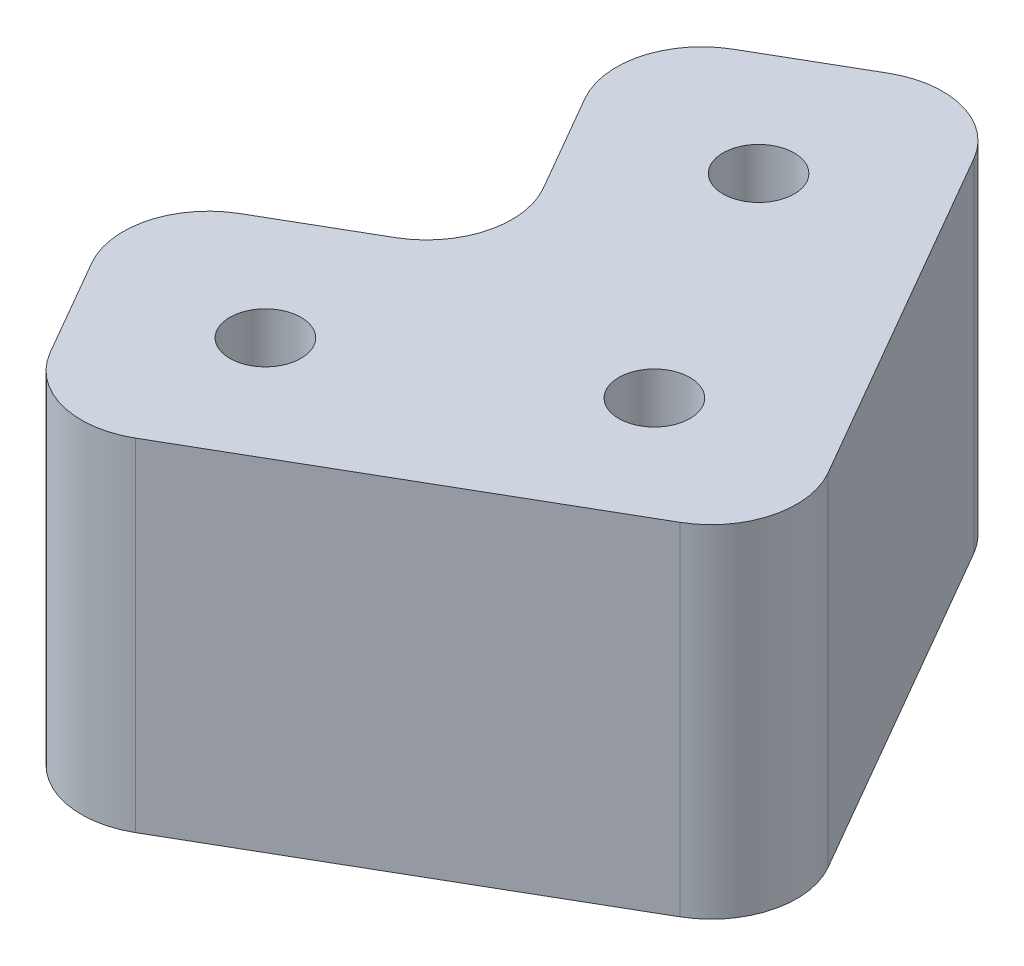
ISO-10303-21;
HEADER;
FILE_DESCRIPTION(('STEP AP214'),'2;1');
FILE_NAME('part.step','',(''),(''),'','','');
FILE_SCHEMA(('AUTOMOTIVE_DESIGN { 1 0 10303 214 1 1 1 1 }'));
ENDSEC;
DATA;
#1=APPLICATION_CONTEXT('core data for automotive mechanical design processes');
#2=APPLICATION_PROTOCOL_DEFINITION('international standard','automotive_design',2000,#1);
#3=PRODUCT_CONTEXT('',#1,'mechanical');
#4=PRODUCT('Part','Part','',(#3));
#5=PRODUCT_RELATED_PRODUCT_CATEGORY('part','',(#4));
#6=PRODUCT_DEFINITION_FORMATION('','',#4);
#7=PRODUCT_DEFINITION_CONTEXT('part definition',#1,'design');
#8=PRODUCT_DEFINITION('design','',#6,#7);
#9=PRODUCT_DEFINITION_SHAPE('','',#8);
#10=(LENGTH_UNIT() NAMED_UNIT(*) SI_UNIT(.MILLI.,.METRE.));
#11=(NAMED_UNIT(*) PLANE_ANGLE_UNIT() SI_UNIT($,.RADIAN.));
#12=(NAMED_UNIT(*) SI_UNIT($,.STERADIAN.) SOLID_ANGLE_UNIT());
#13=UNCERTAINTY_MEASURE_WITH_UNIT(LENGTH_MEASURE(1.E-05),#10,'distance_accuracy_value','');
#14=(GEOMETRIC_REPRESENTATION_CONTEXT(3) GLOBAL_UNCERTAINTY_ASSIGNED_CONTEXT((#13)) GLOBAL_UNIT_ASSIGNED_CONTEXT((#10,
#11,#12)) REPRESENTATION_CONTEXT('',''));
#15=CARTESIAN_POINT('',(0.,0.,0.));
#16=DIRECTION('',(0.,0.,1.));
#17=DIRECTION('',(1.,0.,0.));
#18=AXIS2_PLACEMENT_3D('',#15,#16,#17);
#19=CARTESIAN_POINT('',(0.,12.,0.));
#20=DIRECTION('',(0.,-1.,0.));
#21=DIRECTION('',(0.,0.,-1.));
#22=AXIS2_PLACEMENT_3D('',#19,#20,#21);
#23=PLANE('',#22);
#24=DIRECTION('',(-0.866025403784439,0.,0.499999999999999));
#25=VECTOR('',#24,1.);
#26=CARTESIAN_POINT('',(-68.7916512459885,12.,10.8493649053889));
#27=LINE('',#26,#25);
#28=CARTESIAN_POINT('',(-62.7294734194975,12.,7.3493649053889));
#29=VERTEX_POINT('',#28);
#30=CARTESIAN_POINT('',(-66.1935750346352,12.,9.3493649053889));
#31=VERTEX_POINT('',#30);
#32=EDGE_CURVE('E185',#29,#31,#27,.T.);
#33=ORIENTED_EDGE('',*,*,#32,.T.);
#34=CARTESIAN_POINT('',(-64.6935750346352,12.,11.9474411167422));
#35=DIRECTION('',(0.,-1.,0.));
#36=DIRECTION('',(0.,0.,-1.));
#37=AXIS2_PLACEMENT_3D('',#34,#35,#36);
#38=CIRCLE('',#37,3.);
#39=CARTESIAN_POINT('',(-67.2916512459885,12.,13.4474411167422));
#40=VERTEX_POINT('',#39);
#41=EDGE_CURVE('E228',#31,#40,#38,.F.);
#42=ORIENTED_EDGE('',*,*,#41,.T.);
#43=DIRECTION('',(0.499999999999999,0.,0.866025403784439));
#44=VECTOR('',#43,1.);
#45=CARTESIAN_POINT('',(-63.7916512459886,12.,19.5096189432333));
#46=LINE('',#45,#44);
#47=CARTESIAN_POINT('',(-65.2916512459886,12.,16.91154273188));
#48=VERTEX_POINT('',#47);
#49=EDGE_CURVE('E157',#40,#48,#46,.T.);
#50=ORIENTED_EDGE('',*,*,#49,.T.);
#51=CARTESIAN_POINT('',(-67.8897274573419,12.,18.41154273188));
#52=DIRECTION('',(0.,-1.,0.));
#53=DIRECTION('',(0.,0.,-1.));
#54=AXIS2_PLACEMENT_3D('',#51,#52,#53);
#55=CIRCLE('',#54,3.);
#56=CARTESIAN_POINT('',(-66.3897274573419,12.,21.0096189432333));
#57=VERTEX_POINT('',#56);
#58=EDGE_CURVE('E11',#48,#57,#55,.T.);
#59=ORIENTED_EDGE('',*,*,#58,.T.);
#60=DIRECTION('',(-0.86602540378444,0.,0.499999999999998));
#61=VECTOR('',#60,1.);
#62=CARTESIAN_POINT('',(-72.451905283833,12.,24.5096189432333));
#63=LINE('',#62,#61);
#64=CARTESIAN_POINT('',(-69.8538290724796,12.,23.0096189432333));
#65=VERTEX_POINT('',#64);
#66=EDGE_CURVE('E262',#57,#65,#63,.T.);
#67=ORIENTED_EDGE('',*,*,#66,.T.);
#68=CARTESIAN_POINT('',(-68.3538290724796,12.,25.6076951545866));
#69=DIRECTION('',(0.,-1.,0.));
#70=DIRECTION('',(0.,0.,-1.));
#71=AXIS2_PLACEMENT_3D('',#68,#69,#70);
#72=CIRCLE('',#71,3.);
#73=CARTESIAN_POINT('',(-70.951905283833,12.,27.1076951545866));
#74=VERTEX_POINT('',#73);
#75=EDGE_CURVE('E213',#65,#74,#72,.F.);
#76=ORIENTED_EDGE('',*,*,#75,.T.);
#77=DIRECTION('',(0.499999999999999,0.,0.866025403784439));
#78=VECTOR('',#77,1.);
#79=CARTESIAN_POINT('',(-67.451905283833,12.,33.1698729810777));
#80=LINE('',#79,#78);
#81=CARTESIAN_POINT('',(-68.951905283833,12.,30.5717967697244));
#82=VERTEX_POINT('',#81);
#83=EDGE_CURVE('E259',#74,#82,#80,.T.);
#84=ORIENTED_EDGE('',*,*,#83,.T.);
#85=CARTESIAN_POINT('',(-66.3538290724796,12.,29.0717967697244));
#86=DIRECTION('',(0.,-1.,0.));
#87=DIRECTION('',(0.,0.,-1.));
#88=AXIS2_PLACEMENT_3D('',#85,#86,#87);
#89=CIRCLE('',#88,3.);
#90=CARTESIAN_POINT('',(-64.8538290724797,12.,31.6698729810777));
#91=VERTEX_POINT('',#90);
#92=EDGE_CURVE('E219',#82,#91,#89,.F.);
#93=ORIENTED_EDGE('',*,*,#92,.T.);
#94=DIRECTION('',(0.86602540378444,0.,-0.499999999999998));
#95=VECTOR('',#94,1.);
#96=CARTESIAN_POINT('',(-50.1313972081442,12.,23.1698729810777));
#97=LINE('',#96,#95);
#98=CARTESIAN_POINT('',(-52.7294734194975,12.,24.6698729810777));
#99=VERTEX_POINT('',#98);
#100=EDGE_CURVE('E257',#91,#99,#97,.T.);
#101=ORIENTED_EDGE('',*,*,#100,.T.);
#102=CARTESIAN_POINT('',(-54.2294734194975,12.,22.0717967697244));
#103=DIRECTION('',(0.,-1.,0.));
#104=DIRECTION('',(0.,0.,-1.));
#105=AXIS2_PLACEMENT_3D('',#102,#103,#104);
#106=CIRCLE('',#105,3.);
#107=CARTESIAN_POINT('',(-51.6313972081442,12.,20.5717967697244));
#108=VERTEX_POINT('',#107);
#109=EDGE_CURVE('E70',#99,#108,#106,.F.);
#110=ORIENTED_EDGE('',*,*,#109,.T.);
#111=DIRECTION('',(-0.499999999999998,0.,-0.86602540378444));
#112=VECTOR('',#111,1.);
#113=CARTESIAN_POINT('',(-60.1313972081441,12.,5.84936490538891));
#114=LINE('',#113,#112);
#115=CARTESIAN_POINT('',(-58.6313972081442,12.,8.44744111674223));
#116=VERTEX_POINT('',#115);
#117=EDGE_CURVE('E260',#108,#116,#114,.T.);
#118=ORIENTED_EDGE('',*,*,#117,.T.);
#119=CARTESIAN_POINT('',(-61.2294734194975,12.,9.94744111674222));
#120=DIRECTION('',(0.,-1.,0.));
#121=DIRECTION('',(0.,0.,-1.));
#122=AXIS2_PLACEMENT_3D('',#119,#120,#121);
#123=CIRCLE('',#122,3.);
#124=EDGE_CURVE('E221',#116,#29,#123,.F.);
#125=ORIENTED_EDGE('',*,*,#124,.T.);
#126=EDGE_LOOP('',(#33,#42,#50,#59,#67,#76,#84,#93,#101,#110,#118,#125));
#127=FACE_BOUND('',#126,.T.);
#128=CARTESIAN_POINT('',(-56.9615242270664,12.,21.3397459621555));
#129=DIRECTION('',(0.,1.,0.));
#130=DIRECTION('',(0.,0.,1.));
#131=AXIS2_PLACEMENT_3D('',#128,#129,#130);
#132=CIRCLE('',#131,1.25);
#133=CARTESIAN_POINT('',(-56.9615242270664,12.,22.5897459621555));
#134=VERTEX_POINT('',#133);
#135=EDGE_CURVE('E169',#134,#134,#132,.T.);
#136=ORIENTED_EDGE('',*,*,#135,.F.);
#137=EDGE_LOOP('',(#136));
#138=FACE_BOUND('',#137,.T.);
#139=CARTESIAN_POINT('',(-61.9615242270664,12.,12.6794919243111));
#140=DIRECTION('',(0.,1.,0.));
#141=DIRECTION('',(0.,0.,1.));
#142=AXIS2_PLACEMENT_3D('',#139,#140,#141);
#143=CIRCLE('',#142,1.25);
#144=CARTESIAN_POINT('',(-61.9615242270664,12.,13.9294919243111));
#145=VERTEX_POINT('',#144);
#146=EDGE_CURVE('E312',#145,#145,#143,.T.);
#147=ORIENTED_EDGE('',*,*,#146,.F.);
#148=EDGE_LOOP('',(#147));
#149=FACE_BOUND('',#148,.T.);
#150=CARTESIAN_POINT('',(-65.6217782649108,12.,26.3397459621555));
#151=DIRECTION('',(0.,1.,0.));
#152=DIRECTION('',(0.,0.,1.));
#153=AXIS2_PLACEMENT_3D('',#150,#151,#152);
#154=CIRCLE('',#153,1.25);
#155=CARTESIAN_POINT('',(-65.6217782649108,12.,27.5897459621555));
#156=VERTEX_POINT('',#155);
#157=EDGE_CURVE('E319',#156,#156,#154,.T.);
#158=ORIENTED_EDGE('',*,*,#157,.F.);
#159=EDGE_LOOP('',(#158));
#160=FACE_BOUND('',#159,.T.);
#161=ADVANCED_FACE('F50',(#127,#138,#149,#160),#23,.F.);
#162=CARTESIAN_POINT('',(0.,0.,0.));
#163=DIRECTION('',(0.,-1.,0.));
#164=DIRECTION('',(0.,0.,-1.));
#165=AXIS2_PLACEMENT_3D('',#162,#163,#164);
#166=PLANE('',#165);
#167=CARTESIAN_POINT('',(-61.9615242270664,0.,12.6794919243111));
#168=DIRECTION('',(0.,1.,0.));
#169=DIRECTION('',(0.,0.,1.));
#170=AXIS2_PLACEMENT_3D('',#167,#168,#169);
#171=CIRCLE('',#170,1.25);
#172=CARTESIAN_POINT('',(-61.9615242270664,0.,13.9294919243111));
#173=VERTEX_POINT('',#172);
#174=EDGE_CURVE('E314',#173,#173,#171,.T.);
#175=ORIENTED_EDGE('',*,*,#174,.T.);
#176=EDGE_LOOP('',(#175));
#177=FACE_BOUND('',#176,.T.);
#178=DIRECTION('',(0.499999999999999,0.,0.866025403784439));
#179=VECTOR('',#178,1.);
#180=CARTESIAN_POINT('',(-63.7916512459886,0.,19.5096189432333));
#181=LINE('',#180,#179);
#182=CARTESIAN_POINT('',(-67.2916512459885,0.,13.4474411167422));
#183=VERTEX_POINT('',#182);
#184=CARTESIAN_POINT('',(-65.2916512459886,0.,16.91154273188));
#185=VERTEX_POINT('',#184);
#186=EDGE_CURVE('E158',#183,#185,#181,.T.);
#187=ORIENTED_EDGE('',*,*,#186,.F.);
#188=CARTESIAN_POINT('',(-64.6935750346352,0.,11.9474411167422));
#189=DIRECTION('',(0.,-1.,0.));
#190=DIRECTION('',(0.,0.,-1.));
#191=AXIS2_PLACEMENT_3D('',#188,#189,#190);
#192=CIRCLE('',#191,3.);
#193=CARTESIAN_POINT('',(-66.1935750346352,0.,9.3493649053889));
#194=VERTEX_POINT('',#193);
#195=EDGE_CURVE('E136',#183,#194,#192,.T.);
#196=ORIENTED_EDGE('',*,*,#195,.T.);
#197=DIRECTION('',(-0.866025403784439,0.,0.499999999999999));
#198=VECTOR('',#197,1.);
#199=CARTESIAN_POINT('',(-68.7916512459885,0.,10.8493649053889));
#200=LINE('',#199,#198);
#201=CARTESIAN_POINT('',(-62.7294734194975,0.,7.3493649053889));
#202=VERTEX_POINT('',#201);
#203=EDGE_CURVE('E193',#202,#194,#200,.T.);
#204=ORIENTED_EDGE('',*,*,#203,.F.);
#205=CARTESIAN_POINT('',(-61.2294734194975,0.,9.94744111674222));
#206=DIRECTION('',(0.,-1.,0.));
#207=DIRECTION('',(0.,0.,-1.));
#208=AXIS2_PLACEMENT_3D('',#205,#206,#207);
#209=CIRCLE('',#208,3.);
#210=CARTESIAN_POINT('',(-58.6313972081442,0.,8.44744111674223));
#211=VERTEX_POINT('',#210);
#212=EDGE_CURVE('E148',#202,#211,#209,.T.);
#213=ORIENTED_EDGE('',*,*,#212,.T.);
#214=DIRECTION('',(-0.499999999999998,0.,-0.86602540378444));
#215=VECTOR('',#214,1.);
#216=CARTESIAN_POINT('',(-60.1313972081441,0.,5.84936490538891));
#217=LINE('',#216,#215);
#218=CARTESIAN_POINT('',(-51.6313972081442,0.,20.5717967697244));
#219=VERTEX_POINT('',#218);
#220=EDGE_CURVE('E195',#219,#211,#217,.T.);
#221=ORIENTED_EDGE('',*,*,#220,.F.);
#222=CARTESIAN_POINT('',(-54.2294734194975,0.,22.0717967697244));
#223=DIRECTION('',(0.,-1.,0.));
#224=DIRECTION('',(0.,0.,-1.));
#225=AXIS2_PLACEMENT_3D('',#222,#223,#224);
#226=CIRCLE('',#225,3.);
#227=CARTESIAN_POINT('',(-52.7294734194975,0.,24.6698729810777));
#228=VERTEX_POINT('',#227);
#229=EDGE_CURVE('E204',#219,#228,#226,.T.);
#230=ORIENTED_EDGE('',*,*,#229,.T.);
#231=DIRECTION('',(0.86602540378444,0.,-0.499999999999998));
#232=VECTOR('',#231,1.);
#233=CARTESIAN_POINT('',(-50.1313972081442,0.,23.1698729810777));
#234=LINE('',#233,#232);
#235=CARTESIAN_POINT('',(-64.8538290724797,0.,31.6698729810777));
#236=VERTEX_POINT('',#235);
#237=EDGE_CURVE('E189',#236,#228,#234,.T.);
#238=ORIENTED_EDGE('',*,*,#237,.F.);
#239=CARTESIAN_POINT('',(-66.3538290724796,0.,29.0717967697244));
#240=DIRECTION('',(0.,-1.,0.));
#241=DIRECTION('',(0.,0.,-1.));
#242=AXIS2_PLACEMENT_3D('',#239,#240,#241);
#243=CIRCLE('',#242,3.);
#244=CARTESIAN_POINT('',(-68.951905283833,0.,30.5717967697244));
#245=VERTEX_POINT('',#244);
#246=EDGE_CURVE('E205',#236,#245,#243,.T.);
#247=ORIENTED_EDGE('',*,*,#246,.T.);
#248=DIRECTION('',(0.499999999999999,0.,0.866025403784439));
#249=VECTOR('',#248,1.);
#250=CARTESIAN_POINT('',(-67.451905283833,0.,33.1698729810777));
#251=LINE('',#250,#249);
#252=CARTESIAN_POINT('',(-70.951905283833,0.,27.1076951545866));
#253=VERTEX_POINT('',#252);
#254=EDGE_CURVE('E174',#253,#245,#251,.T.);
#255=ORIENTED_EDGE('',*,*,#254,.F.);
#256=CARTESIAN_POINT('',(-68.3538290724796,0.,25.6076951545866));
#257=DIRECTION('',(0.,-1.,0.));
#258=DIRECTION('',(0.,0.,-1.));
#259=AXIS2_PLACEMENT_3D('',#256,#257,#258);
#260=CIRCLE('',#259,3.);
#261=CARTESIAN_POINT('',(-69.8538290724796,0.,23.0096189432333));
#262=VERTEX_POINT('',#261);
#263=EDGE_CURVE('E163',#253,#262,#260,.T.);
#264=ORIENTED_EDGE('',*,*,#263,.T.);
#265=DIRECTION('',(-0.86602540378444,0.,0.499999999999998));
#266=VECTOR('',#265,1.);
#267=CARTESIAN_POINT('',(-72.451905283833,0.,24.5096189432333));
#268=LINE('',#267,#266);
#269=CARTESIAN_POINT('',(-66.3897274573419,0.,21.0096189432333));
#270=VERTEX_POINT('',#269);
#271=EDGE_CURVE('E166',#270,#262,#268,.T.);
#272=ORIENTED_EDGE('',*,*,#271,.F.);
#273=CARTESIAN_POINT('',(-67.8897274573419,0.,18.41154273188));
#274=DIRECTION('',(0.,-1.,0.));
#275=DIRECTION('',(0.,0.,-1.));
#276=AXIS2_PLACEMENT_3D('',#273,#274,#275);
#277=CIRCLE('',#276,3.);
#278=EDGE_CURVE('E57',#270,#185,#277,.F.);
#279=ORIENTED_EDGE('',*,*,#278,.T.);
#280=EDGE_LOOP('',(#187,#196,#204,#213,#221,#230,#238,#247,#255,#264,#272,#279));
#281=FACE_BOUND('',#280,.T.);
#282=CARTESIAN_POINT('',(-56.9615242270664,0.,21.3397459621555));
#283=DIRECTION('',(0.,1.,0.));
#284=DIRECTION('',(0.,0.,1.));
#285=AXIS2_PLACEMENT_3D('',#282,#283,#284);
#286=CIRCLE('',#285,1.25);
#287=CARTESIAN_POINT('',(-56.9615242270664,0.,22.5897459621555));
#288=VERTEX_POINT('',#287);
#289=EDGE_CURVE('E177',#288,#288,#286,.T.);
#290=ORIENTED_EDGE('',*,*,#289,.T.);
#291=EDGE_LOOP('',(#290));
#292=FACE_BOUND('',#291,.T.);
#293=CARTESIAN_POINT('',(-65.6217782649108,0.,26.3397459621555));
#294=DIRECTION('',(0.,1.,0.));
#295=DIRECTION('',(0.,0.,1.));
#296=AXIS2_PLACEMENT_3D('',#293,#294,#295);
#297=CIRCLE('',#296,1.25);
#298=CARTESIAN_POINT('',(-65.6217782649108,0.,27.5897459621555));
#299=VERTEX_POINT('',#298);
#300=EDGE_CURVE('E325',#299,#299,#297,.T.);
#301=ORIENTED_EDGE('',*,*,#300,.T.);
#302=EDGE_LOOP('',(#301));
#303=FACE_BOUND('',#302,.T.);
#304=ADVANCED_FACE('F165',(#177,#281,#292,#303),#166,.T.);
#305=CARTESIAN_POINT('',(-63.7916512459886,12.,19.5096189432333));
#306=DIRECTION('',(0.866025403784439,0.,-0.499999999999999));
#307=DIRECTION('',(-0.499999999999999,0.,-0.866025403784439));
#308=AXIS2_PLACEMENT_3D('',#305,#306,#307);
#309=PLANE('',#308);
#310=ORIENTED_EDGE('',*,*,#49,.F.);
#311=DIRECTION('',(0.,-1.,0.));
#312=VECTOR('',#311,1.);
#313=CARTESIAN_POINT('',(-67.2916512459885,12.,13.4474411167422));
#314=LINE('',#313,#312);
#315=EDGE_CURVE('E145',#40,#183,#314,.T.);
#316=ORIENTED_EDGE('',*,*,#315,.T.);
#317=ORIENTED_EDGE('',*,*,#186,.T.);
#318=DIRECTION('',(0.,-1.,0.));
#319=VECTOR('',#318,1.);
#320=CARTESIAN_POINT('',(-65.2916512459886,12.,16.91154273188));
#321=LINE('',#320,#319);
#322=EDGE_CURVE('E162',#185,#48,#321,.F.);
#323=ORIENTED_EDGE('',*,*,#322,.T.);
#324=EDGE_LOOP('',(#310,#316,#317,#323));
#325=FACE_BOUND('',#324,.T.);
#326=ADVANCED_FACE('F155',(#325),#309,.F.);
#327=CARTESIAN_POINT('',(-72.451905283833,12.,24.5096189432333));
#328=DIRECTION('',(0.499999999999998,0.,0.86602540378444));
#329=DIRECTION('',(0.86602540378444,0.,-0.499999999999998));
#330=AXIS2_PLACEMENT_3D('',#327,#328,#329);
#331=PLANE('',#330);
#332=ORIENTED_EDGE('',*,*,#66,.F.);
#333=DIRECTION('',(0.,-1.,0.));
#334=VECTOR('',#333,1.);
#335=CARTESIAN_POINT('',(-66.3897274573419,0.,21.0096189432333));
#336=LINE('',#335,#334);
#337=EDGE_CURVE('E252',#57,#270,#336,.T.);
#338=ORIENTED_EDGE('',*,*,#337,.T.);
#339=ORIENTED_EDGE('',*,*,#271,.T.);
#340=DIRECTION('',(0.,-1.,0.));
#341=VECTOR('',#340,1.);
#342=CARTESIAN_POINT('',(-69.8538290724796,12.,23.0096189432333));
#343=LINE('',#342,#341);
#344=EDGE_CURVE('E248',#262,#65,#343,.F.);
#345=ORIENTED_EDGE('',*,*,#344,.T.);
#346=EDGE_LOOP('',(#332,#338,#339,#345));
#347=FACE_BOUND('',#346,.T.);
#348=ADVANCED_FACE('F302',(#347),#331,.F.);
#349=CARTESIAN_POINT('',(-67.451905283833,12.,33.1698729810777));
#350=DIRECTION('',(0.866025403784439,0.,-0.499999999999999));
#351=DIRECTION('',(-0.499999999999999,0.,-0.866025403784439));
#352=AXIS2_PLACEMENT_3D('',#349,#350,#351);
#353=PLANE('',#352);
#354=ORIENTED_EDGE('',*,*,#254,.T.);
#355=DIRECTION('',(0.,-1.,0.));
#356=VECTOR('',#355,1.);
#357=CARTESIAN_POINT('',(-68.951905283833,12.,30.5717967697244));
#358=LINE('',#357,#356);
#359=EDGE_CURVE('E246',#245,#82,#358,.F.);
#360=ORIENTED_EDGE('',*,*,#359,.T.);
#361=ORIENTED_EDGE('',*,*,#83,.F.);
#362=DIRECTION('',(0.,-1.,0.));
#363=VECTOR('',#362,1.);
#364=CARTESIAN_POINT('',(-70.951905283833,12.,27.1076951545866));
#365=LINE('',#364,#363);
#366=EDGE_CURVE('E245',#74,#253,#365,.T.);
#367=ORIENTED_EDGE('',*,*,#366,.T.);
#368=EDGE_LOOP('',(#354,#360,#361,#367));
#369=FACE_BOUND('',#368,.T.);
#370=ADVANCED_FACE('F300',(#369),#353,.F.);
#371=CARTESIAN_POINT('',(-50.1313972081442,12.,23.1698729810777));
#372=DIRECTION('',(-0.499999999999998,0.,-0.86602540378444));
#373=DIRECTION('',(-0.86602540378444,0.,0.499999999999998));
#374=AXIS2_PLACEMENT_3D('',#371,#372,#373);
#375=PLANE('',#374);
#376=ORIENTED_EDGE('',*,*,#237,.T.);
#377=DIRECTION('',(0.,-1.,0.));
#378=VECTOR('',#377,1.);
#379=CARTESIAN_POINT('',(-52.7294734194975,12.,24.6698729810777));
#380=LINE('',#379,#378);
#381=EDGE_CURVE('E237',#228,#99,#380,.F.);
#382=ORIENTED_EDGE('',*,*,#381,.T.);
#383=ORIENTED_EDGE('',*,*,#100,.F.);
#384=DIRECTION('',(0.,-1.,0.));
#385=VECTOR('',#384,1.);
#386=CARTESIAN_POINT('',(-64.8538290724797,12.,31.6698729810777));
#387=LINE('',#386,#385);
#388=EDGE_CURVE('E232',#91,#236,#387,.T.);
#389=ORIENTED_EDGE('',*,*,#388,.T.);
#390=EDGE_LOOP('',(#376,#382,#383,#389));
#391=FACE_BOUND('',#390,.T.);
#392=ADVANCED_FACE('F287',(#391),#375,.F.);
#393=CARTESIAN_POINT('',(-60.1313972081441,12.,5.84936490538891));
#394=DIRECTION('',(-0.86602540378444,0.,0.499999999999998));
#395=DIRECTION('',(0.499999999999998,0.,0.86602540378444));
#396=AXIS2_PLACEMENT_3D('',#393,#394,#395);
#397=PLANE('',#396);
#398=ORIENTED_EDGE('',*,*,#220,.T.);
#399=DIRECTION('',(0.,-1.,0.));
#400=VECTOR('',#399,1.);
#401=CARTESIAN_POINT('',(-58.6313972081442,12.,8.44744111674223));
#402=LINE('',#401,#400);
#403=EDGE_CURVE('E64',#211,#116,#402,.F.);
#404=ORIENTED_EDGE('',*,*,#403,.T.);
#405=ORIENTED_EDGE('',*,*,#117,.F.);
#406=DIRECTION('',(0.,-1.,0.));
#407=VECTOR('',#406,1.);
#408=CARTESIAN_POINT('',(-51.6313972081442,12.,20.5717967697244));
#409=LINE('',#408,#407);
#410=EDGE_CURVE('E230',#108,#219,#409,.T.);
#411=ORIENTED_EDGE('',*,*,#410,.T.);
#412=EDGE_LOOP('',(#398,#404,#405,#411));
#413=FACE_BOUND('',#412,.T.);
#414=ADVANCED_FACE('F282',(#413),#397,.F.);
#415=CARTESIAN_POINT('',(-68.7916512459885,12.,10.8493649053889));
#416=DIRECTION('',(0.499999999999999,0.,0.866025403784439));
#417=DIRECTION('',(0.866025403784439,0.,-0.499999999999999));
#418=AXIS2_PLACEMENT_3D('',#415,#416,#417);
#419=PLANE('',#418);
#420=ORIENTED_EDGE('',*,*,#203,.T.);
#421=DIRECTION('',(0.,-1.,0.));
#422=VECTOR('',#421,1.);
#423=CARTESIAN_POINT('',(-66.1935750346352,12.,9.3493649053889));
#424=LINE('',#423,#422);
#425=EDGE_CURVE('E141',#194,#31,#424,.F.);
#426=ORIENTED_EDGE('',*,*,#425,.T.);
#427=ORIENTED_EDGE('',*,*,#32,.F.);
#428=DIRECTION('',(0.,-1.,0.));
#429=VECTOR('',#428,1.);
#430=CARTESIAN_POINT('',(-62.7294734194975,12.,7.3493649053889));
#431=LINE('',#430,#429);
#432=EDGE_CURVE('E146',#29,#202,#431,.T.);
#433=ORIENTED_EDGE('',*,*,#432,.T.);
#434=EDGE_LOOP('',(#420,#426,#427,#433));
#435=FACE_BOUND('',#434,.T.);
#436=ADVANCED_FACE('F279',(#435),#419,.F.);
#437=CARTESIAN_POINT('',(-56.9615242270664,12.,21.3397459621555));
#438=DIRECTION('',(0.,-1.,0.));
#439=DIRECTION('',(0.,0.,-1.));
#440=AXIS2_PLACEMENT_3D('',#437,#438,#439);
#441=CYLINDRICAL_SURFACE('',#440,1.25);
#442=ORIENTED_EDGE('',*,*,#135,.T.);
#443=EDGE_LOOP('',(#442));
#444=FACE_BOUND('',#443,.T.);
#445=ORIENTED_EDGE('',*,*,#289,.F.);
#446=EDGE_LOOP('',(#445));
#447=FACE_BOUND('',#446,.T.);
#448=ADVANCED_FACE('F338',(#444,#447),#441,.F.);
#449=CARTESIAN_POINT('',(-61.9615242270664,12.,12.6794919243111));
#450=DIRECTION('',(0.,-1.,0.));
#451=DIRECTION('',(0.,0.,-1.));
#452=AXIS2_PLACEMENT_3D('',#449,#450,#451);
#453=CYLINDRICAL_SURFACE('',#452,1.25);
#454=ORIENTED_EDGE('',*,*,#146,.T.);
#455=EDGE_LOOP('',(#454));
#456=FACE_BOUND('',#455,.T.);
#457=ORIENTED_EDGE('',*,*,#174,.F.);
#458=EDGE_LOOP('',(#457));
#459=FACE_BOUND('',#458,.T.);
#460=ADVANCED_FACE('F453',(#456,#459),#453,.F.);
#461=CARTESIAN_POINT('',(-65.6217782649108,12.,26.3397459621555));
#462=DIRECTION('',(0.,-1.,0.));
#463=DIRECTION('',(0.,0.,-1.));
#464=AXIS2_PLACEMENT_3D('',#461,#462,#463);
#465=CYLINDRICAL_SURFACE('',#464,1.25);
#466=ORIENTED_EDGE('',*,*,#157,.T.);
#467=EDGE_LOOP('',(#466));
#468=FACE_BOUND('',#467,.T.);
#469=ORIENTED_EDGE('',*,*,#300,.F.);
#470=EDGE_LOOP('',(#469));
#471=FACE_BOUND('',#470,.T.);
#472=ADVANCED_FACE('F330',(#468,#471),#465,.F.);
#473=CARTESIAN_POINT('',(-64.6935750346352,12.,11.9474411167422));
#474=DIRECTION('',(0.,-1.,0.));
#475=DIRECTION('',(0.,0.,-1.));
#476=AXIS2_PLACEMENT_3D('',#473,#474,#475);
#477=CYLINDRICAL_SURFACE('',#476,3.);
#478=ORIENTED_EDGE('',*,*,#41,.F.);
#479=ORIENTED_EDGE('',*,*,#425,.F.);
#480=ORIENTED_EDGE('',*,*,#195,.F.);
#481=ORIENTED_EDGE('',*,*,#315,.F.);
#482=EDGE_LOOP('',(#478,#479,#480,#481));
#483=FACE_BOUND('',#482,.T.);
#484=ADVANCED_FACE('F142',(#483),#477,.T.);
#485=CARTESIAN_POINT('',(-61.2294734194975,12.,9.94744111674222));
#486=DIRECTION('',(0.,-1.,0.));
#487=DIRECTION('',(0.,0.,-1.));
#488=AXIS2_PLACEMENT_3D('',#485,#486,#487);
#489=CYLINDRICAL_SURFACE('',#488,3.);
#490=ORIENTED_EDGE('',*,*,#124,.F.);
#491=ORIENTED_EDGE('',*,*,#403,.F.);
#492=ORIENTED_EDGE('',*,*,#212,.F.);
#493=ORIENTED_EDGE('',*,*,#432,.F.);
#494=EDGE_LOOP('',(#490,#491,#492,#493));
#495=FACE_BOUND('',#494,.T.);
#496=ADVANCED_FACE('F278',(#495),#489,.T.);
#497=CARTESIAN_POINT('',(-54.2294734194975,12.,22.0717967697244));
#498=DIRECTION('',(0.,-1.,0.));
#499=DIRECTION('',(0.,0.,-1.));
#500=AXIS2_PLACEMENT_3D('',#497,#498,#499);
#501=CYLINDRICAL_SURFACE('',#500,3.);
#502=ORIENTED_EDGE('',*,*,#109,.F.);
#503=ORIENTED_EDGE('',*,*,#381,.F.);
#504=ORIENTED_EDGE('',*,*,#229,.F.);
#505=ORIENTED_EDGE('',*,*,#410,.F.);
#506=EDGE_LOOP('',(#502,#503,#504,#505));
#507=FACE_BOUND('',#506,.T.);
#508=ADVANCED_FACE('F285',(#507),#501,.T.);
#509=CARTESIAN_POINT('',(-66.3538290724796,12.,29.0717967697244));
#510=DIRECTION('',(0.,-1.,0.));
#511=DIRECTION('',(0.,0.,-1.));
#512=AXIS2_PLACEMENT_3D('',#509,#510,#511);
#513=CYLINDRICAL_SURFACE('',#512,3.);
#514=ORIENTED_EDGE('',*,*,#92,.F.);
#515=ORIENTED_EDGE('',*,*,#359,.F.);
#516=ORIENTED_EDGE('',*,*,#246,.F.);
#517=ORIENTED_EDGE('',*,*,#388,.F.);
#518=EDGE_LOOP('',(#514,#515,#516,#517));
#519=FACE_BOUND('',#518,.T.);
#520=ADVANCED_FACE('F291',(#519),#513,.T.);
#521=CARTESIAN_POINT('',(-67.8897274573419,12.,18.41154273188));
#522=DIRECTION('',(0.,1.,0.));
#523=DIRECTION('',(0.,0.,1.));
#524=AXIS2_PLACEMENT_3D('',#521,#522,#523);
#525=CYLINDRICAL_SURFACE('',#524,3.);
#526=ORIENTED_EDGE('',*,*,#58,.F.);
#527=ORIENTED_EDGE('',*,*,#322,.F.);
#528=ORIENTED_EDGE('',*,*,#278,.F.);
#529=ORIENTED_EDGE('',*,*,#337,.F.);
#530=EDGE_LOOP('',(#526,#527,#528,#529));
#531=FACE_BOUND('',#530,.T.);
#532=ADVANCED_FACE('F308',(#531),#525,.F.);
#533=CARTESIAN_POINT('',(-68.3538290724796,12.,25.6076951545866));
#534=DIRECTION('',(0.,-1.,0.));
#535=DIRECTION('',(0.,0.,-1.));
#536=AXIS2_PLACEMENT_3D('',#533,#534,#535);
#537=CYLINDRICAL_SURFACE('',#536,3.);
#538=ORIENTED_EDGE('',*,*,#75,.F.);
#539=ORIENTED_EDGE('',*,*,#344,.F.);
#540=ORIENTED_EDGE('',*,*,#263,.F.);
#541=ORIENTED_EDGE('',*,*,#366,.F.);
#542=EDGE_LOOP('',(#538,#539,#540,#541));
#543=FACE_BOUND('',#542,.T.);
#544=ADVANCED_FACE('F47',(#543),#537,.T.);
#545=CLOSED_SHELL('',(#161,#304,#326,#348,#370,#392,#414,#436,#448,#460,#472,#484,#496,#508,
#520,#532,#544));
#546=MANIFOLD_SOLID_BREP('B2',#545);
#547=ADVANCED_BREP_SHAPE_REPRESENTATION('',(#18,#546),#14);
#548=SHAPE_DEFINITION_REPRESENTATION(#9,#547);
ENDSEC;
END-ISO-10303-21;
